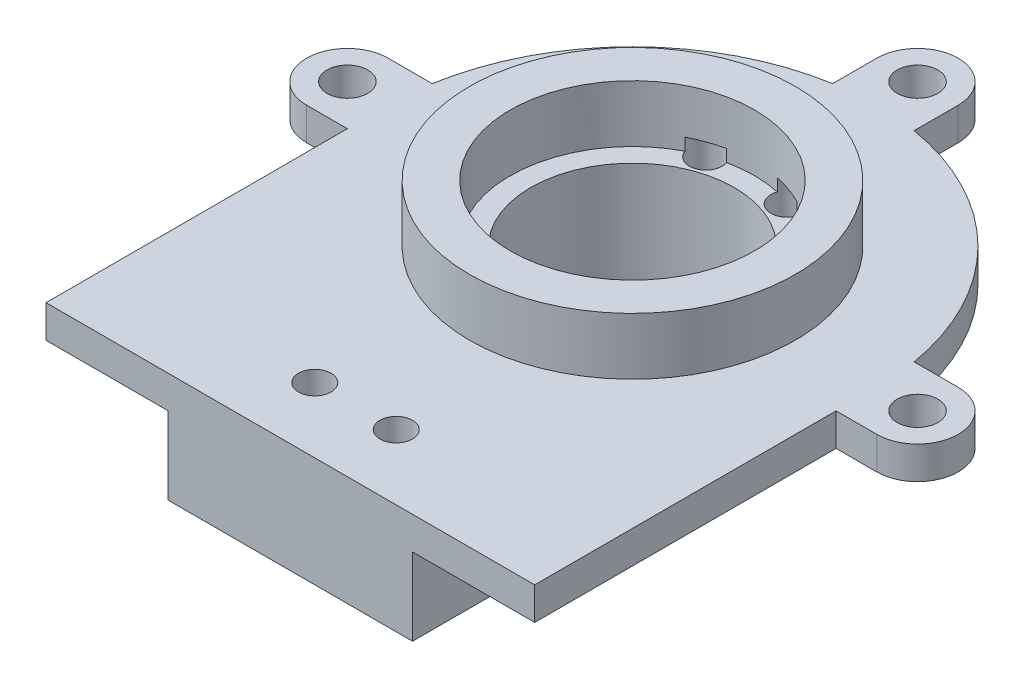
ISO-10303-21;
HEADER;
FILE_DESCRIPTION(('STEP AP214'),'2;1');
FILE_NAME('part.step','',(''),(''),'','','');
FILE_SCHEMA(('AUTOMOTIVE_DESIGN { 1 0 10303 214 1 1 1 1 }'));
ENDSEC;
DATA;
#1=APPLICATION_CONTEXT('core data for automotive mechanical design processes');
#2=APPLICATION_PROTOCOL_DEFINITION('international standard','automotive_design',2000,#1);
#3=PRODUCT_CONTEXT('',#1,'mechanical');
#4=PRODUCT('Part','Part','',(#3));
#5=PRODUCT_RELATED_PRODUCT_CATEGORY('part','',(#4));
#6=PRODUCT_DEFINITION_FORMATION('','',#4);
#7=PRODUCT_DEFINITION_CONTEXT('part definition',#1,'design');
#8=PRODUCT_DEFINITION('design','',#6,#7);
#9=PRODUCT_DEFINITION_SHAPE('','',#8);
#10=(LENGTH_UNIT() NAMED_UNIT(*) SI_UNIT(.MILLI.,.METRE.));
#11=(NAMED_UNIT(*) PLANE_ANGLE_UNIT() SI_UNIT($,.RADIAN.));
#12=(NAMED_UNIT(*) SI_UNIT($,.STERADIAN.) SOLID_ANGLE_UNIT());
#13=UNCERTAINTY_MEASURE_WITH_UNIT(LENGTH_MEASURE(1.E-05),#10,'distance_accuracy_value','');
#14=(GEOMETRIC_REPRESENTATION_CONTEXT(3) GLOBAL_UNCERTAINTY_ASSIGNED_CONTEXT((#13)) GLOBAL_UNIT_ASSIGNED_CONTEXT((#10,
#11,#12)) REPRESENTATION_CONTEXT('',''));
#15=CARTESIAN_POINT('',(0.,0.,0.));
#16=DIRECTION('',(0.,0.,1.));
#17=DIRECTION('',(1.,0.,0.));
#18=AXIS2_PLACEMENT_3D('',#15,#16,#17);
#19=CARTESIAN_POINT('',(0.,-9.5,0.));
#20=DIRECTION('',(0.,1.,0.));
#21=DIRECTION('',(0.,0.,1.));
#22=AXIS2_PLACEMENT_3D('',#19,#20,#21);
#23=CYLINDRICAL_SURFACE('',#22,30.);
#24=DIRECTION('',(0.,1.,0.));
#25=VECTOR('',#24,1.);
#26=CARTESIAN_POINT('',(29.5803989154981,-9.5,-5.));
#27=LINE('',#26,#25);
#28=CARTESIAN_POINT('',(29.5803989154981,-4.,-5.));
#29=VERTEX_POINT('',#28);
#30=CARTESIAN_POINT('',(29.5803989154981,0.,-5.));
#31=VERTEX_POINT('',#30);
#32=EDGE_CURVE('E223',#29,#31,#27,.T.);
#33=ORIENTED_EDGE('',*,*,#32,.F.);
#34=CARTESIAN_POINT('',(0.,-4.,0.));
#35=DIRECTION('',(0.,-1.,0.));
#36=DIRECTION('',(0.,0.,-1.));
#37=AXIS2_PLACEMENT_3D('',#34,#35,#36);
#38=CIRCLE('',#37,30.);
#39=CARTESIAN_POINT('',(5.,-4.,-29.5803989154981));
#40=VERTEX_POINT('',#39);
#41=EDGE_CURVE('E206',#40,#29,#38,.T.);
#42=ORIENTED_EDGE('',*,*,#41,.F.);
#43=DIRECTION('',(0.,1.,0.));
#44=VECTOR('',#43,1.);
#45=CARTESIAN_POINT('',(5.,-9.5,-29.5803989154981));
#46=LINE('',#45,#44);
#47=CARTESIAN_POINT('',(5.,0.,-29.5803989154981));
#48=VERTEX_POINT('',#47);
#49=EDGE_CURVE('E43',#48,#40,#46,.F.);
#50=ORIENTED_EDGE('',*,*,#49,.F.);
#51=CARTESIAN_POINT('',(0.,0.,0.));
#52=DIRECTION('',(0.,1.,0.));
#53=DIRECTION('',(0.,0.,1.));
#54=AXIS2_PLACEMENT_3D('',#51,#52,#53);
#55=CIRCLE('',#54,30.);
#56=EDGE_CURVE('E299',#31,#48,#55,.T.);
#57=ORIENTED_EDGE('',*,*,#56,.F.);
#58=EDGE_LOOP('',(#33,#42,#50,#57));
#59=FACE_BOUND('',#58,.T.);
#60=ADVANCED_FACE('F35',(#59),#23,.T.);
#61=CARTESIAN_POINT('',(0.,-4.,0.));
#62=DIRECTION('',(0.,-1.,0.));
#63=DIRECTION('',(0.,0.,-1.));
#64=AXIS2_PLACEMENT_3D('',#61,#62,#63);
#65=PLANE('',#64);
#66=DIRECTION('',(1.,0.,0.));
#67=VECTOR('',#66,1.);
#68=CARTESIAN_POINT('',(27.,-4.,5.));
#69=LINE('',#68,#67);
#70=CARTESIAN_POINT('',(30.,-4.,5.));
#71=VERTEX_POINT('',#70);
#72=CARTESIAN_POINT('',(35.,-4.,5.));
#73=VERTEX_POINT('',#72);
#74=EDGE_CURVE('E195',#71,#73,#69,.T.);
#75=ORIENTED_EDGE('',*,*,#74,.F.);
#76=DIRECTION('',(0.,0.,1.));
#77=VECTOR('',#76,1.);
#78=CARTESIAN_POINT('',(30.,-4.,0.));
#79=LINE('',#78,#77);
#80=CARTESIAN_POINT('',(30.,-4.,42.));
#81=VERTEX_POINT('',#80);
#82=EDGE_CURVE('E321',#71,#81,#79,.T.);
#83=ORIENTED_EDGE('',*,*,#82,.T.);
#84=DIRECTION('',(-1.,0.,0.));
#85=VECTOR('',#84,1.);
#86=CARTESIAN_POINT('',(0.,-4.,42.));
#87=LINE('',#86,#85);
#88=CARTESIAN_POINT('',(15.0000000000001,-4.,42.));
#89=VERTEX_POINT('',#88);
#90=EDGE_CURVE('E317',#81,#89,#87,.T.);
#91=ORIENTED_EDGE('',*,*,#90,.T.);
#92=DIRECTION('',(0.,0.,1.));
#93=VECTOR('',#92,1.);
#94=CARTESIAN_POINT('',(15.0000000000001,-4.,-21.9999999999996));
#95=LINE('',#94,#93);
#96=CARTESIAN_POINT('',(15.0000000000001,-4.,-21.9999999999996));
#97=VERTEX_POINT('',#96);
#98=EDGE_CURVE('E341',#97,#89,#95,.T.);
#99=ORIENTED_EDGE('',*,*,#98,.F.);
#100=DIRECTION('',(1.,0.,0.));
#101=VECTOR('',#100,1.);
#102=CARTESIAN_POINT('',(15.0000000000001,-4.,-21.9999999999996));
#103=LINE('',#102,#101);
#104=CARTESIAN_POINT('',(-14.9999999999998,-4.,-21.9999999999996));
#105=VERTEX_POINT('',#104);
#106=EDGE_CURVE('E346',#105,#97,#103,.T.);
#107=ORIENTED_EDGE('',*,*,#106,.F.);
#108=DIRECTION('',(0.,0.,-1.));
#109=VECTOR('',#108,1.);
#110=CARTESIAN_POINT('',(-14.9999999999998,-4.,-21.9999999999996));
#111=LINE('',#110,#109);
#112=CARTESIAN_POINT('',(-14.9999999999998,-4.,42.));
#113=VERTEX_POINT('',#112);
#114=EDGE_CURVE('E355',#113,#105,#111,.T.);
#115=ORIENTED_EDGE('',*,*,#114,.F.);
#116=CARTESIAN_POINT('',(-30.,-4.,42.));
#117=VERTEX_POINT('',#116);
#118=EDGE_CURVE('E312',#113,#117,#87,.T.);
#119=ORIENTED_EDGE('',*,*,#118,.T.);
#120=DIRECTION('',(0.,0.,-1.));
#121=VECTOR('',#120,1.);
#122=CARTESIAN_POINT('',(-30.,-4.,0.));
#123=LINE('',#122,#121);
#124=CARTESIAN_POINT('',(-30.,-4.,5.));
#125=VERTEX_POINT('',#124);
#126=EDGE_CURVE('E318',#117,#125,#123,.T.);
#127=ORIENTED_EDGE('',*,*,#126,.T.);
#128=DIRECTION('',(1.,0.,0.));
#129=VECTOR('',#128,1.);
#130=CARTESIAN_POINT('',(-27.,-4.,5.));
#131=LINE('',#130,#129);
#132=CARTESIAN_POINT('',(-35.,-4.,5.));
#133=VERTEX_POINT('',#132);
#134=EDGE_CURVE('E259',#133,#125,#131,.T.);
#135=ORIENTED_EDGE('',*,*,#134,.F.);
#136=CARTESIAN_POINT('',(-35.,-4.,0.));
#137=DIRECTION('',(0.,1.,0.));
#138=DIRECTION('',(0.,0.,1.));
#139=AXIS2_PLACEMENT_3D('',#136,#137,#138);
#140=CIRCLE('',#139,5.);
#141=CARTESIAN_POINT('',(-35.,-4.,-5.));
#142=VERTEX_POINT('',#141);
#143=EDGE_CURVE('E256',#142,#133,#140,.T.);
#144=ORIENTED_EDGE('',*,*,#143,.F.);
#145=DIRECTION('',(-1.,0.,0.));
#146=VECTOR('',#145,1.);
#147=CARTESIAN_POINT('',(-35.,-4.,-5.));
#148=LINE('',#147,#146);
#149=CARTESIAN_POINT('',(-29.5803989154981,-4.,-5.));
#150=VERTEX_POINT('',#149);
#151=EDGE_CURVE('E262',#150,#142,#148,.T.);
#152=ORIENTED_EDGE('',*,*,#151,.F.);
#153=CARTESIAN_POINT('',(-5.,-4.,-29.5803989154981));
#154=VERTEX_POINT('',#153);
#155=EDGE_CURVE('E323',#150,#154,#38,.T.);
#156=ORIENTED_EDGE('',*,*,#155,.T.);
#157=DIRECTION('',(0.,0.,1.));
#158=VECTOR('',#157,1.);
#159=CARTESIAN_POINT('',(-5.,-4.,-35.));
#160=LINE('',#159,#158);
#161=CARTESIAN_POINT('',(-5.,-4.,-35.));
#162=VERTEX_POINT('',#161);
#163=EDGE_CURVE('E236',#162,#154,#160,.T.);
#164=ORIENTED_EDGE('',*,*,#163,.F.);
#165=CARTESIAN_POINT('',(0.,-4.,-35.));
#166=DIRECTION('',(0.,1.,0.));
#167=DIRECTION('',(0.,0.,1.));
#168=AXIS2_PLACEMENT_3D('',#165,#166,#167);
#169=CIRCLE('',#168,5.);
#170=CARTESIAN_POINT('',(5.,-4.,-35.));
#171=VERTEX_POINT('',#170);
#172=EDGE_CURVE('E233',#171,#162,#169,.T.);
#173=ORIENTED_EDGE('',*,*,#172,.F.);
#174=DIRECTION('',(0.,0.,-1.));
#175=VECTOR('',#174,1.);
#176=CARTESIAN_POINT('',(5.,-4.,-27.));
#177=LINE('',#176,#175);
#178=EDGE_CURVE('E239',#40,#171,#177,.T.);
#179=ORIENTED_EDGE('',*,*,#178,.F.);
#180=ORIENTED_EDGE('',*,*,#41,.T.);
#181=DIRECTION('',(-1.,0.,0.));
#182=VECTOR('',#181,1.);
#183=CARTESIAN_POINT('',(35.,-4.,-5.));
#184=LINE('',#183,#182);
#185=CARTESIAN_POINT('',(35.,-4.,-5.));
#186=VERTEX_POINT('',#185);
#187=EDGE_CURVE('E186',#186,#29,#184,.T.);
#188=ORIENTED_EDGE('',*,*,#187,.F.);
#189=CARTESIAN_POINT('',(35.,-4.,0.));
#190=DIRECTION('',(0.,1.,0.));
#191=DIRECTION('',(0.,0.,1.));
#192=AXIS2_PLACEMENT_3D('',#189,#190,#191);
#193=CIRCLE('',#192,5.);
#194=EDGE_CURVE('E203',#73,#186,#193,.T.);
#195=ORIENTED_EDGE('',*,*,#194,.F.);
#196=EDGE_LOOP('',(#75,#83,#91,#99,#107,#115,#119,#127,#135,#144,#152,#156,#164,#173,#179,#180,
#188,#195));
#197=FACE_BOUND('',#196,.T.);
#198=CARTESIAN_POINT('',(-35.,-4.,0.));
#199=DIRECTION('',(0.,1.,0.));
#200=DIRECTION('',(0.,0.,1.));
#201=AXIS2_PLACEMENT_3D('',#198,#199,#200);
#202=CIRCLE('',#201,2.5);
#203=CARTESIAN_POINT('',(-35.,-4.,2.5));
#204=VERTEX_POINT('',#203);
#205=EDGE_CURVE('E250',#204,#204,#202,.T.);
#206=ORIENTED_EDGE('',*,*,#205,.T.);
#207=EDGE_LOOP('',(#206));
#208=FACE_BOUND('',#207,.T.);
#209=CARTESIAN_POINT('',(0.,-4.,-35.));
#210=DIRECTION('',(0.,1.,0.));
#211=DIRECTION('',(0.,0.,1.));
#212=AXIS2_PLACEMENT_3D('',#209,#210,#211);
#213=CIRCLE('',#212,2.5);
#214=CARTESIAN_POINT('',(0.,-4.,-32.5));
#215=VERTEX_POINT('',#214);
#216=EDGE_CURVE('E227',#215,#215,#213,.T.);
#217=ORIENTED_EDGE('',*,*,#216,.T.);
#218=EDGE_LOOP('',(#217));
#219=FACE_BOUND('',#218,.T.);
#220=CARTESIAN_POINT('',(35.,-4.,0.));
#221=DIRECTION('',(0.,1.,0.));
#222=DIRECTION('',(0.,0.,1.));
#223=AXIS2_PLACEMENT_3D('',#220,#221,#222);
#224=CIRCLE('',#223,2.5);
#225=CARTESIAN_POINT('',(35.,-4.,2.5));
#226=VERTEX_POINT('',#225);
#227=EDGE_CURVE('E221',#226,#226,#224,.T.);
#228=ORIENTED_EDGE('',*,*,#227,.T.);
#229=EDGE_LOOP('',(#228));
#230=FACE_BOUND('',#229,.T.);
#231=ADVANCED_FACE('F201',(#197,#208,#219,#230),#65,.T.);
#232=CARTESIAN_POINT('',(0.,0.,0.));
#233=DIRECTION('',(0.,-1.,0.));
#234=DIRECTION('',(0.,0.,-1.));
#235=AXIS2_PLACEMENT_3D('',#232,#233,#234);
#236=PLANE('',#235);
#237=DIRECTION('',(-1.,0.,0.));
#238=VECTOR('',#237,1.);
#239=CARTESIAN_POINT('',(35.,0.,-5.));
#240=LINE('',#239,#238);
#241=CARTESIAN_POINT('',(35.,0.,-5.));
#242=VERTEX_POINT('',#241);
#243=EDGE_CURVE('E189',#242,#31,#240,.T.);
#244=ORIENTED_EDGE('',*,*,#243,.T.);
#245=ORIENTED_EDGE('',*,*,#56,.T.);
#246=DIRECTION('',(0.,0.,-1.));
#247=VECTOR('',#246,1.);
#248=CARTESIAN_POINT('',(5.,0.,-27.));
#249=LINE('',#248,#247);
#250=CARTESIAN_POINT('',(5.,0.,-35.));
#251=VERTEX_POINT('',#250);
#252=EDGE_CURVE('E237',#48,#251,#249,.T.);
#253=ORIENTED_EDGE('',*,*,#252,.T.);
#254=CARTESIAN_POINT('',(0.,0.,-35.));
#255=DIRECTION('',(0.,1.,0.));
#256=DIRECTION('',(0.,0.,1.));
#257=AXIS2_PLACEMENT_3D('',#254,#255,#256);
#258=CIRCLE('',#257,5.);
#259=CARTESIAN_POINT('',(-5.,0.,-35.));
#260=VERTEX_POINT('',#259);
#261=EDGE_CURVE('E230',#251,#260,#258,.T.);
#262=ORIENTED_EDGE('',*,*,#261,.T.);
#263=DIRECTION('',(0.,0.,1.));
#264=VECTOR('',#263,1.);
#265=CARTESIAN_POINT('',(-5.,0.,-35.));
#266=LINE('',#265,#264);
#267=CARTESIAN_POINT('',(-5.,0.,-29.5803989154981));
#268=VERTEX_POINT('',#267);
#269=EDGE_CURVE('E50',#260,#268,#266,.T.);
#270=ORIENTED_EDGE('',*,*,#269,.T.);
#271=CARTESIAN_POINT('',(-29.5803989154981,0.,-5.));
#272=VERTEX_POINT('',#271);
#273=EDGE_CURVE('E298',#268,#272,#55,.T.);
#274=ORIENTED_EDGE('',*,*,#273,.T.);
#275=DIRECTION('',(-1.,0.,0.));
#276=VECTOR('',#275,1.);
#277=CARTESIAN_POINT('',(-35.,0.,-5.));
#278=LINE('',#277,#276);
#279=CARTESIAN_POINT('',(-35.,0.,-5.));
#280=VERTEX_POINT('',#279);
#281=EDGE_CURVE('E260',#272,#280,#278,.T.);
#282=ORIENTED_EDGE('',*,*,#281,.T.);
#283=CARTESIAN_POINT('',(-35.,0.,0.));
#284=DIRECTION('',(0.,1.,0.));
#285=DIRECTION('',(0.,0.,1.));
#286=AXIS2_PLACEMENT_3D('',#283,#284,#285);
#287=CIRCLE('',#286,5.);
#288=CARTESIAN_POINT('',(-35.,0.,5.));
#289=VERTEX_POINT('',#288);
#290=EDGE_CURVE('E253',#280,#289,#287,.T.);
#291=ORIENTED_EDGE('',*,*,#290,.T.);
#292=DIRECTION('',(1.,0.,0.));
#293=VECTOR('',#292,1.);
#294=CARTESIAN_POINT('',(-27.,0.,5.));
#295=LINE('',#294,#293);
#296=CARTESIAN_POINT('',(-30.,0.,5.));
#297=VERTEX_POINT('',#296);
#298=EDGE_CURVE('E57',#289,#297,#295,.T.);
#299=ORIENTED_EDGE('',*,*,#298,.T.);
#300=DIRECTION('',(0.,0.,1.));
#301=VECTOR('',#300,1.);
#302=CARTESIAN_POINT('',(-30.,0.,0.));
#303=LINE('',#302,#301);
#304=CARTESIAN_POINT('',(-30.,0.,42.));
#305=VERTEX_POINT('',#304);
#306=EDGE_CURVE('E301',#297,#305,#303,.T.);
#307=ORIENTED_EDGE('',*,*,#306,.T.);
#308=DIRECTION('',(1.,0.,0.));
#309=VECTOR('',#308,1.);
#310=CARTESIAN_POINT('',(-30.,0.,42.));
#311=LINE('',#310,#309);
#312=CARTESIAN_POINT('',(30.,0.,42.));
#313=VERTEX_POINT('',#312);
#314=EDGE_CURVE('E303',#305,#313,#311,.T.);
#315=ORIENTED_EDGE('',*,*,#314,.T.);
#316=DIRECTION('',(0.,0.,-1.));
#317=VECTOR('',#316,1.);
#318=CARTESIAN_POINT('',(30.,0.,42.));
#319=LINE('',#318,#317);
#320=CARTESIAN_POINT('',(30.,0.,5.));
#321=VERTEX_POINT('',#320);
#322=EDGE_CURVE('E306',#313,#321,#319,.T.);
#323=ORIENTED_EDGE('',*,*,#322,.T.);
#324=DIRECTION('',(1.,0.,0.));
#325=VECTOR('',#324,1.);
#326=CARTESIAN_POINT('',(27.,0.,5.));
#327=LINE('',#326,#325);
#328=CARTESIAN_POINT('',(35.,0.,5.));
#329=VERTEX_POINT('',#328);
#330=EDGE_CURVE('E211',#321,#329,#327,.T.);
#331=ORIENTED_EDGE('',*,*,#330,.T.);
#332=CARTESIAN_POINT('',(35.,0.,0.));
#333=DIRECTION('',(0.,1.,0.));
#334=DIRECTION('',(0.,0.,1.));
#335=AXIS2_PLACEMENT_3D('',#332,#333,#334);
#336=CIRCLE('',#335,5.);
#337=EDGE_CURVE('E219',#329,#242,#336,.T.);
#338=ORIENTED_EDGE('',*,*,#337,.T.);
#339=EDGE_LOOP('',(#244,#245,#253,#262,#270,#274,#282,#291,#299,#307,#315,#323,#331,#338));
#340=FACE_BOUND('',#339,.T.);
#341=CARTESIAN_POINT('',(5.00000000000064,0.,34.0000000000004));
#342=DIRECTION('',(0.,-1.,0.));
#343=DIRECTION('',(0.,0.,-1.));
#344=AXIS2_PLACEMENT_3D('',#341,#342,#343);
#345=CIRCLE('',#344,2.00000000010648);
#346=CARTESIAN_POINT('',(5.00000000000064,0.,31.9999999998939));
#347=VERTEX_POINT('',#346);
#348=EDGE_CURVE('E281',#347,#347,#345,.T.);
#349=ORIENTED_EDGE('',*,*,#348,.T.);
#350=EDGE_LOOP('',(#349));
#351=FACE_BOUND('',#350,.T.);
#352=CARTESIAN_POINT('',(-4.99999999999936,0.,34.0000000000004));
#353=DIRECTION('',(0.,-1.,0.));
#354=DIRECTION('',(0.,0.,-1.));
#355=AXIS2_PLACEMENT_3D('',#352,#353,#354);
#356=CIRCLE('',#355,2.00000000010648);
#357=CARTESIAN_POINT('',(-4.99999999999936,0.,31.9999999998939));
#358=VERTEX_POINT('',#357);
#359=EDGE_CURVE('E278',#358,#358,#356,.T.);
#360=ORIENTED_EDGE('',*,*,#359,.T.);
#361=EDGE_LOOP('',(#360));
#362=FACE_BOUND('',#361,.T.);
#363=CARTESIAN_POINT('',(0.,0.,0.));
#364=DIRECTION('',(0.,1.,0.));
#365=DIRECTION('',(0.,0.,1.));
#366=AXIS2_PLACEMENT_3D('',#363,#364,#365);
#367=CIRCLE('',#366,20.);
#368=CARTESIAN_POINT('',(0.,0.,20.));
#369=VERTEX_POINT('',#368);
#370=EDGE_CURVE('E370',#369,#369,#367,.T.);
#371=ORIENTED_EDGE('',*,*,#370,.F.);
#372=EDGE_LOOP('',(#371));
#373=FACE_BOUND('',#372,.T.);
#374=CARTESIAN_POINT('',(-35.,0.,0.));
#375=DIRECTION('',(0.,1.,0.));
#376=DIRECTION('',(0.,0.,1.));
#377=AXIS2_PLACEMENT_3D('',#374,#375,#376);
#378=CIRCLE('',#377,2.5);
#379=CARTESIAN_POINT('',(-35.,0.,2.5));
#380=VERTEX_POINT('',#379);
#381=EDGE_CURVE('E248',#380,#380,#378,.T.);
#382=ORIENTED_EDGE('',*,*,#381,.F.);
#383=EDGE_LOOP('',(#382));
#384=FACE_BOUND('',#383,.T.);
#385=CARTESIAN_POINT('',(0.,0.,-35.));
#386=DIRECTION('',(0.,1.,0.));
#387=DIRECTION('',(0.,0.,1.));
#388=AXIS2_PLACEMENT_3D('',#385,#386,#387);
#389=CIRCLE('',#388,2.5);
#390=CARTESIAN_POINT('',(0.,0.,-32.5));
#391=VERTEX_POINT('',#390);
#392=EDGE_CURVE('E226',#391,#391,#389,.T.);
#393=ORIENTED_EDGE('',*,*,#392,.F.);
#394=EDGE_LOOP('',(#393));
#395=FACE_BOUND('',#394,.T.);
#396=CARTESIAN_POINT('',(35.,0.,0.));
#397=DIRECTION('',(0.,1.,0.));
#398=DIRECTION('',(0.,0.,1.));
#399=AXIS2_PLACEMENT_3D('',#396,#397,#398);
#400=CIRCLE('',#399,2.5);
#401=CARTESIAN_POINT('',(35.,0.,2.5));
#402=VERTEX_POINT('',#401);
#403=EDGE_CURVE('E215',#402,#402,#400,.T.);
#404=ORIENTED_EDGE('',*,*,#403,.F.);
#405=EDGE_LOOP('',(#404));
#406=FACE_BOUND('',#405,.T.);
#407=ADVANCED_FACE('F403',(#340,#351,#362,#373,#384,#395,#406),#236,.F.);
#408=CARTESIAN_POINT('',(0.,7.,0.));
#409=DIRECTION('',(0.,1.,0.));
#410=DIRECTION('',(0.,0.,1.));
#411=AXIS2_PLACEMENT_3D('',#408,#409,#410);
#412=PLANE('',#411);
#413=CARTESIAN_POINT('',(0.,7.,0.));
#414=DIRECTION('',(0.,1.,0.));
#415=DIRECTION('',(0.,0.,1.));
#416=AXIS2_PLACEMENT_3D('',#413,#414,#415);
#417=CIRCLE('',#416,20.);
#418=CARTESIAN_POINT('',(0.,7.,20.));
#419=VERTEX_POINT('',#418);
#420=EDGE_CURVE('E374',#419,#419,#417,.T.);
#421=ORIENTED_EDGE('',*,*,#420,.T.);
#422=EDGE_LOOP('',(#421));
#423=FACE_BOUND('',#422,.T.);
#424=CARTESIAN_POINT('',(0.,7.,0.));
#425=DIRECTION('',(0.,1.,0.));
#426=DIRECTION('',(0.,0.,1.));
#427=AXIS2_PLACEMENT_3D('',#424,#425,#426);
#428=CIRCLE('',#427,15.);
#429=CARTESIAN_POINT('',(0.,7.,15.));
#430=VERTEX_POINT('',#429);
#431=EDGE_CURVE('E371',#430,#430,#428,.T.);
#432=ORIENTED_EDGE('',*,*,#431,.F.);
#433=EDGE_LOOP('',(#432));
#434=FACE_BOUND('',#433,.T.);
#435=ADVANCED_FACE('F525',(#423,#434),#412,.T.);
#436=CARTESIAN_POINT('',(0.,7.,0.));
#437=DIRECTION('',(0.,-1.,0.));
#438=DIRECTION('',(0.,0.,-1.));
#439=AXIS2_PLACEMENT_3D('',#436,#437,#438);
#440=CYLINDRICAL_SURFACE('',#439,20.);
#441=ORIENTED_EDGE('',*,*,#420,.F.);
#442=EDGE_LOOP('',(#441));
#443=FACE_BOUND('',#442,.T.);
#444=ORIENTED_EDGE('',*,*,#370,.T.);
#445=EDGE_LOOP('',(#444));
#446=FACE_BOUND('',#445,.T.);
#447=ADVANCED_FACE('F37',(#443,#446),#440,.T.);
#448=CARTESIAN_POINT('',(0.,7.,0.));
#449=DIRECTION('',(0.,-1.,0.));
#450=DIRECTION('',(0.,0.,-1.));
#451=AXIS2_PLACEMENT_3D('',#448,#449,#450);
#452=CYLINDRICAL_SURFACE('',#451,15.);
#453=DIRECTION('',(0.,-1.,0.));
#454=VECTOR('',#453,1.);
#455=CARTESIAN_POINT('',(-3.11651617670493,-6.,-14.6726727940187));
#456=LINE('',#455,#454);
#457=CARTESIAN_POINT('',(-3.11651617670494,0.,-14.6726727940187));
#458=VERTEX_POINT('',#457);
#459=CARTESIAN_POINT('',(-3.11651617670493,1.5,-14.6726727940187));
#460=VERTEX_POINT('',#459);
#461=EDGE_CURVE('E289',#458,#460,#456,.F.);
#462=ORIENTED_EDGE('',*,*,#461,.F.);
#463=CARTESIAN_POINT('',(0.,0.,0.));
#464=DIRECTION('',(0.,1.,0.));
#465=DIRECTION('',(0.,0.,1.));
#466=AXIS2_PLACEMENT_3D('',#463,#464,#465);
#467=CIRCLE('',#466,15.);
#468=CARTESIAN_POINT('',(3.11651617670606,0.,-14.6726727940185));
#469=VERTEX_POINT('',#468);
#470=EDGE_CURVE('E375',#469,#458,#467,.T.);
#471=ORIENTED_EDGE('',*,*,#470,.F.);
#472=DIRECTION('',(0.,-1.,0.));
#473=VECTOR('',#472,1.);
#474=CARTESIAN_POINT('',(3.11651617670607,-6.,-14.6726727940185));
#475=LINE('',#474,#473);
#476=CARTESIAN_POINT('',(3.11651617670607,1.5,-14.6726727940185));
#477=VERTEX_POINT('',#476);
#478=EDGE_CURVE('E294',#477,#469,#475,.T.);
#479=ORIENTED_EDGE('',*,*,#478,.F.);
#480=CARTESIAN_POINT('',(0.,1.5,0.));
#481=DIRECTION('',(0.,-1.,0.));
#482=DIRECTION('',(0.,0.,-1.));
#483=AXIS2_PLACEMENT_3D('',#480,#481,#482);
#484=CIRCLE('',#483,15.);
#485=CARTESIAN_POINT('',(6.8834838232857,1.5,-13.3273272059541));
#486=VERTEX_POINT('',#485);
#487=EDGE_CURVE('E381',#477,#486,#484,.T.);
#488=ORIENTED_EDGE('',*,*,#487,.T.);
#489=DIRECTION('',(0.,-1.,0.));
#490=VECTOR('',#489,1.);
#491=CARTESIAN_POINT('',(6.8834838232857,-6.,-13.3273272059541));
#492=LINE('',#491,#490);
#493=CARTESIAN_POINT('',(6.8834838232857,0.,-13.3273272059541));
#494=VERTEX_POINT('',#493);
#495=EDGE_CURVE('E296',#494,#486,#492,.F.);
#496=ORIENTED_EDGE('',*,*,#495,.F.);
#497=CARTESIAN_POINT('',(-6.88348382328487,0.,-13.3273272059545));
#498=VERTEX_POINT('',#497);
#499=EDGE_CURVE('E376',#498,#494,#467,.T.);
#500=ORIENTED_EDGE('',*,*,#499,.F.);
#501=DIRECTION('',(0.,-1.,0.));
#502=VECTOR('',#501,1.);
#503=CARTESIAN_POINT('',(-6.88348382328487,-6.,-13.3273272059545));
#504=LINE('',#503,#502);
#505=CARTESIAN_POINT('',(-6.88348382328487,1.5,-13.3273272059545));
#506=VERTEX_POINT('',#505);
#507=EDGE_CURVE('E287',#506,#498,#504,.T.);
#508=ORIENTED_EDGE('',*,*,#507,.F.);
#509=CARTESIAN_POINT('',(0.,1.5,0.));
#510=DIRECTION('',(0.,-1.,0.));
#511=DIRECTION('',(0.,0.,-1.));
#512=AXIS2_PLACEMENT_3D('',#509,#510,#511);
#513=CIRCLE('',#512,15.);
#514=EDGE_CURVE('E386',#506,#460,#513,.T.);
#515=ORIENTED_EDGE('',*,*,#514,.T.);
#516=EDGE_LOOP('',(#462,#471,#479,#488,#496,#500,#508,#515));
#517=FACE_BOUND('',#516,.T.);
#518=ORIENTED_EDGE('',*,*,#431,.T.);
#519=EDGE_LOOP('',(#518));
#520=FACE_BOUND('',#519,.T.);
#521=ADVANCED_FACE('F526',(#517,#520),#452,.F.);
#522=CARTESIAN_POINT('',(0.,0.,0.));
#523=DIRECTION('',(0.,-1.,0.));
#524=DIRECTION('',(0.,0.,-1.));
#525=AXIS2_PLACEMENT_3D('',#522,#523,#524);
#526=CIRCLE('',#525,12.5);
#527=CARTESIAN_POINT('',(0.,0.,-12.5));
#528=VERTEX_POINT('',#527);
#529=EDGE_CURVE('E367',#528,#528,#526,.T.);
#530=ORIENTED_EDGE('',*,*,#529,.T.);
#531=EDGE_LOOP('',(#530));
#532=FACE_BOUND('',#531,.T.);
#533=ORIENTED_EDGE('',*,*,#470,.T.);
#534=CARTESIAN_POINT('',(-4.99999999999953,0.,-13.9999999999996));
#535=DIRECTION('',(0.,-1.,0.));
#536=DIRECTION('',(0.,0.,-1.));
#537=AXIS2_PLACEMENT_3D('',#534,#535,#536);
#538=CIRCLE('',#537,2.00000000010648);
#539=EDGE_CURVE('E284',#458,#498,#538,.T.);
#540=ORIENTED_EDGE('',*,*,#539,.T.);
#541=ORIENTED_EDGE('',*,*,#499,.T.);
#542=CARTESIAN_POINT('',(5.00000000000064,0.,-13.9999999999996));
#543=DIRECTION('',(0.,-1.,0.));
#544=DIRECTION('',(0.,0.,-1.));
#545=AXIS2_PLACEMENT_3D('',#542,#543,#544);
#546=CIRCLE('',#545,2.00000000010637);
#547=EDGE_CURVE('E291',#494,#469,#546,.T.);
#548=ORIENTED_EDGE('',*,*,#547,.T.);
#549=EDGE_LOOP('',(#533,#540,#541,#548));
#550=FACE_BOUND('',#549,.T.);
#551=ADVANCED_FACE('F520',(#532,#550),#236,.F.);
#552=CARTESIAN_POINT('',(0.,-4.,0.));
#553=DIRECTION('',(0.,1.,0.));
#554=DIRECTION('',(0.,0.,1.));
#555=AXIS2_PLACEMENT_3D('',#552,#553,#554);
#556=CYLINDRICAL_SURFACE('',#555,12.5);
#557=ORIENTED_EDGE('',*,*,#529,.F.);
#558=EDGE_LOOP('',(#557));
#559=FACE_BOUND('',#558,.T.);
#560=CARTESIAN_POINT('',(0.,-13.5,0.));
#561=DIRECTION('',(0.,-1.,0.));
#562=DIRECTION('',(0.,0.,-1.));
#563=AXIS2_PLACEMENT_3D('',#560,#561,#562);
#564=CIRCLE('',#563,12.5);
#565=CARTESIAN_POINT('',(0.,-13.5,-12.5));
#566=VERTEX_POINT('',#565);
#567=EDGE_CURVE('E326',#566,#566,#564,.T.);
#568=ORIENTED_EDGE('',*,*,#567,.T.);
#569=EDGE_LOOP('',(#568));
#570=FACE_BOUND('',#569,.T.);
#571=ADVANCED_FACE('F509',(#559,#570),#556,.F.);
#572=CARTESIAN_POINT('',(0.,-13.5,0.));
#573=DIRECTION('',(0.,-1.,0.));
#574=DIRECTION('',(0.,0.,-1.));
#575=AXIS2_PLACEMENT_3D('',#572,#573,#574);
#576=PLANE('',#575);
#577=CARTESIAN_POINT('',(5.00000000000047,-13.5,-13.9999999999996));
#578=DIRECTION('',(0.,-1.,0.));
#579=DIRECTION('',(0.,0.,-1.));
#580=AXIS2_PLACEMENT_3D('',#577,#578,#579);
#581=CIRCLE('',#580,2.00000000010648);
#582=CARTESIAN_POINT('',(5.00000000000047,-13.5,-16.0000000001061));
#583=VERTEX_POINT('',#582);
#584=EDGE_CURVE('E329',#583,#583,#581,.T.);
#585=ORIENTED_EDGE('',*,*,#584,.F.);
#586=EDGE_LOOP('',(#585));
#587=FACE_BOUND('',#586,.T.);
#588=CARTESIAN_POINT('',(5.00000000000064,-13.5,34.0000000000004));
#589=DIRECTION('',(0.,-1.,0.));
#590=DIRECTION('',(0.,0.,-1.));
#591=AXIS2_PLACEMENT_3D('',#588,#589,#590);
#592=CIRCLE('',#591,2.00000000010648);
#593=CARTESIAN_POINT('',(5.00000000000064,-13.5,31.9999999998939));
#594=VERTEX_POINT('',#593);
#595=EDGE_CURVE('E335',#594,#594,#592,.T.);
#596=ORIENTED_EDGE('',*,*,#595,.F.);
#597=EDGE_LOOP('',(#596));
#598=FACE_BOUND('',#597,.T.);
#599=DIRECTION('',(0.,0.,1.));
#600=VECTOR('',#599,1.);
#601=CARTESIAN_POINT('',(15.0000000000001,-13.5,-21.9999999999996));
#602=LINE('',#601,#600);
#603=CARTESIAN_POINT('',(15.0000000000001,-13.5,-21.9999999999996));
#604=VERTEX_POINT('',#603);
#605=CARTESIAN_POINT('',(15.0000000000001,-13.5,42.0000000000004));
#606=VERTEX_POINT('',#605);
#607=EDGE_CURVE('E342',#604,#606,#602,.T.);
#608=ORIENTED_EDGE('',*,*,#607,.T.);
#609=DIRECTION('',(-1.,0.,0.));
#610=VECTOR('',#609,1.);
#611=CARTESIAN_POINT('',(15.0000000000001,-13.5,42.0000000000004));
#612=LINE('',#611,#610);
#613=CARTESIAN_POINT('',(-14.9999999999998,-13.5,42.0000000000004));
#614=VERTEX_POINT('',#613);
#615=EDGE_CURVE('E345',#606,#614,#612,.T.);
#616=ORIENTED_EDGE('',*,*,#615,.T.);
#617=DIRECTION('',(0.,0.,-1.));
#618=VECTOR('',#617,1.);
#619=CARTESIAN_POINT('',(-14.9999999999998,-13.5,-21.9999999999996));
#620=LINE('',#619,#618);
#621=CARTESIAN_POINT('',(-14.9999999999998,-13.5,-21.9999999999996));
#622=VERTEX_POINT('',#621);
#623=EDGE_CURVE('E348',#614,#622,#620,.T.);
#624=ORIENTED_EDGE('',*,*,#623,.T.);
#625=DIRECTION('',(1.,0.,0.));
#626=VECTOR('',#625,1.);
#627=CARTESIAN_POINT('',(15.0000000000001,-13.5,-21.9999999999996));
#628=LINE('',#627,#626);
#629=EDGE_CURVE('E350',#622,#604,#628,.T.);
#630=ORIENTED_EDGE('',*,*,#629,.T.);
#631=EDGE_LOOP('',(#608,#616,#624,#630));
#632=FACE_BOUND('',#631,.T.);
#633=CARTESIAN_POINT('',(-4.99999999999936,-13.5,34.0000000000004));
#634=DIRECTION('',(0.,-1.,0.));
#635=DIRECTION('',(0.,0.,-1.));
#636=AXIS2_PLACEMENT_3D('',#633,#634,#635);
#637=CIRCLE('',#636,2.00000000010648);
#638=CARTESIAN_POINT('',(-4.99999999999936,-13.5,31.9999999998939));
#639=VERTEX_POINT('',#638);
#640=EDGE_CURVE('E338',#639,#639,#637,.T.);
#641=ORIENTED_EDGE('',*,*,#640,.F.);
#642=EDGE_LOOP('',(#641));
#643=FACE_BOUND('',#642,.T.);
#644=CARTESIAN_POINT('',(-4.99999999999953,-13.5,-13.9999999999996));
#645=DIRECTION('',(0.,-1.,0.));
#646=DIRECTION('',(0.,0.,-1.));
#647=AXIS2_PLACEMENT_3D('',#644,#645,#646);
#648=CIRCLE('',#647,2.00000000010648);
#649=CARTESIAN_POINT('',(-4.99999999999953,-13.5,-16.0000000001061));
#650=VERTEX_POINT('',#649);
#651=EDGE_CURVE('E332',#650,#650,#648,.T.);
#652=ORIENTED_EDGE('',*,*,#651,.F.);
#653=EDGE_LOOP('',(#652));
#654=FACE_BOUND('',#653,.T.);
#655=ORIENTED_EDGE('',*,*,#567,.F.);
#656=EDGE_LOOP('',(#655));
#657=FACE_BOUND('',#656,.T.);
#658=ADVANCED_FACE('F506',(#587,#598,#632,#643,#654,#657),#576,.T.);
#659=CARTESIAN_POINT('',(15.0000000000001,-13.5,-21.9999999999996));
#660=DIRECTION('',(-1.,0.,0.));
#661=DIRECTION('',(0.,0.,1.));
#662=AXIS2_PLACEMENT_3D('',#659,#660,#661);
#663=PLANE('',#662);
#664=ORIENTED_EDGE('',*,*,#98,.T.);
#665=DIRECTION('',(0.,1.,0.));
#666=VECTOR('',#665,1.);
#667=CARTESIAN_POINT('',(15.0000000000001,-13.5,42.0000000000004));
#668=LINE('',#667,#666);
#669=EDGE_CURVE('E365',#606,#89,#668,.T.);
#670=ORIENTED_EDGE('',*,*,#669,.F.);
#671=ORIENTED_EDGE('',*,*,#607,.F.);
#672=DIRECTION('',(0.,1.,0.));
#673=VECTOR('',#672,1.);
#674=CARTESIAN_POINT('',(15.0000000000001,-13.5,-21.9999999999996));
#675=LINE('',#674,#673);
#676=EDGE_CURVE('E352',#604,#97,#675,.T.);
#677=ORIENTED_EDGE('',*,*,#676,.T.);
#678=EDGE_LOOP('',(#664,#670,#671,#677));
#679=FACE_BOUND('',#678,.T.);
#680=ADVANCED_FACE('F424',(#679),#663,.F.);
#681=CARTESIAN_POINT('',(15.0000000000001,-13.5,42.0000000000004));
#682=DIRECTION('',(0.,0.,-1.));
#683=DIRECTION('',(-1.,0.,0.));
#684=AXIS2_PLACEMENT_3D('',#681,#682,#683);
#685=PLANE('',#684);
#686=ORIENTED_EDGE('',*,*,#118,.F.);
#687=DIRECTION('',(0.,1.,0.));
#688=VECTOR('',#687,1.);
#689=CARTESIAN_POINT('',(-14.9999999999998,-13.5,42.0000000000004));
#690=LINE('',#689,#688);
#691=EDGE_CURVE('E363',#614,#113,#690,.T.);
#692=ORIENTED_EDGE('',*,*,#691,.F.);
#693=ORIENTED_EDGE('',*,*,#615,.F.);
#694=ORIENTED_EDGE('',*,*,#669,.T.);
#695=ORIENTED_EDGE('',*,*,#90,.F.);
#696=DIRECTION('',(0.,1.,0.));
#697=VECTOR('',#696,1.);
#698=CARTESIAN_POINT('',(30.,-9.5,42.));
#699=LINE('',#698,#697);
#700=EDGE_CURVE('E310',#81,#313,#699,.T.);
#701=ORIENTED_EDGE('',*,*,#700,.T.);
#702=ORIENTED_EDGE('',*,*,#314,.F.);
#703=DIRECTION('',(0.,1.,0.));
#704=VECTOR('',#703,1.);
#705=CARTESIAN_POINT('',(-30.,-9.5,42.));
#706=LINE('',#705,#704);
#707=EDGE_CURVE('E309',#117,#305,#706,.T.);
#708=ORIENTED_EDGE('',*,*,#707,.F.);
#709=EDGE_LOOP('',(#686,#692,#693,#694,#695,#701,#702,#708));
#710=FACE_BOUND('',#709,.T.);
#711=ADVANCED_FACE('F418',(#710),#685,.F.);
#712=CARTESIAN_POINT('',(-14.9999999999998,-13.5,-21.9999999999996));
#713=DIRECTION('',(1.,0.,0.));
#714=DIRECTION('',(0.,0.,-1.));
#715=AXIS2_PLACEMENT_3D('',#712,#713,#714);
#716=PLANE('',#715);
#717=ORIENTED_EDGE('',*,*,#114,.T.);
#718=DIRECTION('',(0.,1.,0.));
#719=VECTOR('',#718,1.);
#720=CARTESIAN_POINT('',(-14.9999999999998,-13.5,-21.9999999999996));
#721=LINE('',#720,#719);
#722=EDGE_CURVE('E361',#622,#105,#721,.T.);
#723=ORIENTED_EDGE('',*,*,#722,.F.);
#724=ORIENTED_EDGE('',*,*,#623,.F.);
#725=ORIENTED_EDGE('',*,*,#691,.T.);
#726=EDGE_LOOP('',(#717,#723,#724,#725));
#727=FACE_BOUND('',#726,.T.);
#728=ADVANCED_FACE('F433',(#727),#716,.F.);
#729=CARTESIAN_POINT('',(15.0000000000001,-13.5,-21.9999999999996));
#730=DIRECTION('',(0.,0.,1.));
#731=DIRECTION('',(1.,0.,0.));
#732=AXIS2_PLACEMENT_3D('',#729,#730,#731);
#733=PLANE('',#732);
#734=ORIENTED_EDGE('',*,*,#106,.T.);
#735=ORIENTED_EDGE('',*,*,#676,.F.);
#736=ORIENTED_EDGE('',*,*,#629,.F.);
#737=ORIENTED_EDGE('',*,*,#722,.T.);
#738=EDGE_LOOP('',(#734,#735,#736,#737));
#739=FACE_BOUND('',#738,.T.);
#740=ADVANCED_FACE('F429',(#739),#733,.F.);
#741=CARTESIAN_POINT('',(-4.99999999999936,-13.5,34.0000000000004));
#742=DIRECTION('',(0.,1.,0.));
#743=DIRECTION('',(0.,0.,1.));
#744=AXIS2_PLACEMENT_3D('',#741,#742,#743);
#745=CYLINDRICAL_SURFACE('',#744,2.00000000010648);
#746=ORIENTED_EDGE('',*,*,#640,.T.);
#747=EDGE_LOOP('',(#746));
#748=FACE_BOUND('',#747,.T.);
#749=ORIENTED_EDGE('',*,*,#359,.F.);
#750=EDGE_LOOP('',(#749));
#751=FACE_BOUND('',#750,.T.);
#752=ADVANCED_FACE('F501',(#748,#751),#745,.F.);
#753=CARTESIAN_POINT('',(5.00000000000064,-13.5,34.0000000000004));
#754=DIRECTION('',(0.,1.,0.));
#755=DIRECTION('',(0.,0.,1.));
#756=AXIS2_PLACEMENT_3D('',#753,#754,#755);
#757=CYLINDRICAL_SURFACE('',#756,2.00000000010648);
#758=ORIENTED_EDGE('',*,*,#595,.T.);
#759=EDGE_LOOP('',(#758));
#760=FACE_BOUND('',#759,.T.);
#761=ORIENTED_EDGE('',*,*,#348,.F.);
#762=EDGE_LOOP('',(#761));
#763=FACE_BOUND('',#762,.T.);
#764=ADVANCED_FACE('F494',(#760,#763),#757,.F.);
#765=CARTESIAN_POINT('',(-4.99999999999953,-13.5,-13.9999999999996));
#766=DIRECTION('',(0.,1.,0.));
#767=DIRECTION('',(0.,0.,1.));
#768=AXIS2_PLACEMENT_3D('',#765,#766,#767);
#769=CYLINDRICAL_SURFACE('',#768,2.00000000010648);
#770=ORIENTED_EDGE('',*,*,#651,.T.);
#771=EDGE_LOOP('',(#770));
#772=FACE_BOUND('',#771,.T.);
#773=ORIENTED_EDGE('',*,*,#461,.T.);
#774=CARTESIAN_POINT('',(-4.99999999999953,1.5,-13.9999999999996));
#775=DIRECTION('',(0.,-1.,0.));
#776=DIRECTION('',(0.,0.,-1.));
#777=AXIS2_PLACEMENT_3D('',#774,#775,#776);
#778=CIRCLE('',#777,2.00000000010648);
#779=EDGE_CURVE('E275',#506,#460,#778,.T.);
#780=ORIENTED_EDGE('',*,*,#779,.F.);
#781=ORIENTED_EDGE('',*,*,#507,.T.);
#782=ORIENTED_EDGE('',*,*,#539,.F.);
#783=EDGE_LOOP('',(#773,#780,#781,#782));
#784=FACE_BOUND('',#783,.T.);
#785=ADVANCED_FACE('F489',(#772,#784),#769,.F.);
#786=CARTESIAN_POINT('',(5.00000000000047,-13.5,-13.9999999999996));
#787=DIRECTION('',(0.,1.,0.));
#788=DIRECTION('',(0.,0.,1.));
#789=AXIS2_PLACEMENT_3D('',#786,#787,#788);
#790=CYLINDRICAL_SURFACE('',#789,2.00000000010648);
#791=ORIENTED_EDGE('',*,*,#584,.T.);
#792=EDGE_LOOP('',(#791));
#793=FACE_BOUND('',#792,.T.);
#794=ORIENTED_EDGE('',*,*,#495,.T.);
#795=CARTESIAN_POINT('',(5.00000000000064,1.5,-13.9999999999996));
#796=DIRECTION('',(0.,-1.,0.));
#797=DIRECTION('',(0.,0.,-1.));
#798=AXIS2_PLACEMENT_3D('',#795,#796,#797);
#799=CIRCLE('',#798,2.00000000010637);
#800=EDGE_CURVE('E271',#477,#486,#799,.T.);
#801=ORIENTED_EDGE('',*,*,#800,.F.);
#802=ORIENTED_EDGE('',*,*,#478,.T.);
#803=ORIENTED_EDGE('',*,*,#547,.F.);
#804=EDGE_LOOP('',(#794,#801,#802,#803));
#805=FACE_BOUND('',#804,.T.);
#806=ADVANCED_FACE('F483',(#793,#805),#790,.F.);
#807=DIRECTION('',(0.,1.,0.));
#808=VECTOR('',#807,1.);
#809=CARTESIAN_POINT('',(-5.,-9.5,-29.5803989154981));
#810=LINE('',#809,#808);
#811=EDGE_CURVE('E393',#154,#268,#810,.T.);
#812=ORIENTED_EDGE('',*,*,#811,.F.);
#813=ORIENTED_EDGE('',*,*,#155,.F.);
#814=DIRECTION('',(0.,1.,0.));
#815=VECTOR('',#814,1.);
#816=CARTESIAN_POINT('',(-29.5803989154981,-9.5,-5.));
#817=LINE('',#816,#815);
#818=EDGE_CURVE('E391',#272,#150,#817,.F.);
#819=ORIENTED_EDGE('',*,*,#818,.F.);
#820=ORIENTED_EDGE('',*,*,#273,.F.);
#821=EDGE_LOOP('',(#812,#813,#819,#820));
#822=FACE_BOUND('',#821,.T.);
#823=ADVANCED_FACE('F455',(#822),#23,.T.);
#824=CARTESIAN_POINT('',(30.,-9.5,42.));
#825=DIRECTION('',(1.,0.,0.));
#826=DIRECTION('',(0.,0.,-1.));
#827=AXIS2_PLACEMENT_3D('',#824,#825,#826);
#828=PLANE('',#827);
#829=DIRECTION('',(0.,-1.,0.));
#830=VECTOR('',#829,1.);
#831=CARTESIAN_POINT('',(30.,-9.5,5.));
#832=LINE('',#831,#830);
#833=EDGE_CURVE('E11',#321,#71,#832,.T.);
#834=ORIENTED_EDGE('',*,*,#833,.F.);
#835=ORIENTED_EDGE('',*,*,#322,.F.);
#836=ORIENTED_EDGE('',*,*,#700,.F.);
#837=ORIENTED_EDGE('',*,*,#82,.F.);
#838=EDGE_LOOP('',(#834,#835,#836,#837));
#839=FACE_BOUND('',#838,.T.);
#840=ADVANCED_FACE('F414',(#839),#828,.T.);
#841=CARTESIAN_POINT('',(-30.,-9.5,0.));
#842=DIRECTION('',(-1.,0.,0.));
#843=DIRECTION('',(0.,0.,1.));
#844=AXIS2_PLACEMENT_3D('',#841,#842,#843);
#845=PLANE('',#844);
#846=DIRECTION('',(0.,1.,0.));
#847=VECTOR('',#846,1.);
#848=CARTESIAN_POINT('',(-30.,-9.5,5.));
#849=LINE('',#848,#847);
#850=EDGE_CURVE('E389',#125,#297,#849,.T.);
#851=ORIENTED_EDGE('',*,*,#850,.F.);
#852=ORIENTED_EDGE('',*,*,#126,.F.);
#853=ORIENTED_EDGE('',*,*,#707,.T.);
#854=ORIENTED_EDGE('',*,*,#306,.F.);
#855=EDGE_LOOP('',(#851,#852,#853,#854));
#856=FACE_BOUND('',#855,.T.);
#857=ADVANCED_FACE('F439',(#856),#845,.T.);
#858=CARTESIAN_POINT('',(-4.99999999999953,1.5,-13.9999999999996));
#859=DIRECTION('',(0.,-1.,0.));
#860=DIRECTION('',(0.,0.,-1.));
#861=AXIS2_PLACEMENT_3D('',#858,#859,#860);
#862=PLANE('',#861);
#863=ORIENTED_EDGE('',*,*,#779,.T.);
#864=ORIENTED_EDGE('',*,*,#514,.F.);
#865=EDGE_LOOP('',(#863,#864));
#866=FACE_BOUND('',#865,.T.);
#867=ADVANCED_FACE('F669',(#866),#862,.T.);
#868=CARTESIAN_POINT('',(5.00000000000064,1.5,-13.9999999999996));
#869=DIRECTION('',(0.,-1.,0.));
#870=DIRECTION('',(0.,0.,-1.));
#871=AXIS2_PLACEMENT_3D('',#868,#869,#870);
#872=PLANE('',#871);
#873=ORIENTED_EDGE('',*,*,#800,.T.);
#874=ORIENTED_EDGE('',*,*,#487,.F.);
#875=EDGE_LOOP('',(#873,#874));
#876=FACE_BOUND('',#875,.T.);
#877=ADVANCED_FACE('F639',(#876),#872,.T.);
#878=CARTESIAN_POINT('',(-35.,-4.,0.));
#879=DIRECTION('',(0.,1.,0.));
#880=DIRECTION('',(0.,0.,1.));
#881=AXIS2_PLACEMENT_3D('',#878,#879,#880);
#882=CYLINDRICAL_SURFACE('',#881,5.);
#883=ORIENTED_EDGE('',*,*,#290,.F.);
#884=DIRECTION('',(0.,1.,0.));
#885=VECTOR('',#884,1.);
#886=CARTESIAN_POINT('',(-35.,-4.,-5.));
#887=LINE('',#886,#885);
#888=EDGE_CURVE('E268',#142,#280,#887,.T.);
#889=ORIENTED_EDGE('',*,*,#888,.F.);
#890=ORIENTED_EDGE('',*,*,#143,.T.);
#891=DIRECTION('',(0.,1.,0.));
#892=VECTOR('',#891,1.);
#893=CARTESIAN_POINT('',(-35.,-4.,5.));
#894=LINE('',#893,#892);
#895=EDGE_CURVE('E264',#133,#289,#894,.T.);
#896=ORIENTED_EDGE('',*,*,#895,.T.);
#897=EDGE_LOOP('',(#883,#889,#890,#896));
#898=FACE_BOUND('',#897,.T.);
#899=ADVANCED_FACE('F447',(#898),#882,.T.);
#900=CARTESIAN_POINT('',(-35.,-4.,-5.));
#901=DIRECTION('',(0.,0.,-1.));
#902=DIRECTION('',(-1.,0.,0.));
#903=AXIS2_PLACEMENT_3D('',#900,#901,#902);
#904=PLANE('',#903);
#905=ORIENTED_EDGE('',*,*,#281,.F.);
#906=ORIENTED_EDGE('',*,*,#818,.T.);
#907=ORIENTED_EDGE('',*,*,#151,.T.);
#908=ORIENTED_EDGE('',*,*,#888,.T.);
#909=EDGE_LOOP('',(#905,#906,#907,#908));
#910=FACE_BOUND('',#909,.T.);
#911=ADVANCED_FACE('F450',(#910),#904,.T.);
#912=CARTESIAN_POINT('',(-27.,-4.,5.));
#913=DIRECTION('',(0.,0.,1.));
#914=DIRECTION('',(1.,0.,0.));
#915=AXIS2_PLACEMENT_3D('',#912,#913,#914);
#916=PLANE('',#915);
#917=ORIENTED_EDGE('',*,*,#134,.T.);
#918=ORIENTED_EDGE('',*,*,#850,.T.);
#919=ORIENTED_EDGE('',*,*,#298,.F.);
#920=ORIENTED_EDGE('',*,*,#895,.F.);
#921=EDGE_LOOP('',(#917,#918,#919,#920));
#922=FACE_BOUND('',#921,.T.);
#923=ADVANCED_FACE('F470',(#922),#916,.T.);
#924=CARTESIAN_POINT('',(-35.,-4.,0.));
#925=DIRECTION('',(0.,1.,0.));
#926=DIRECTION('',(0.,0.,1.));
#927=AXIS2_PLACEMENT_3D('',#924,#925,#926);
#928=CYLINDRICAL_SURFACE('',#927,2.5);
#929=ORIENTED_EDGE('',*,*,#205,.F.);
#930=EDGE_LOOP('',(#929));
#931=FACE_BOUND('',#930,.T.);
#932=ORIENTED_EDGE('',*,*,#381,.T.);
#933=EDGE_LOOP('',(#932));
#934=FACE_BOUND('',#933,.T.);
#935=ADVANCED_FACE('F463',(#931,#934),#928,.F.);
#936=CARTESIAN_POINT('',(0.,-4.,-35.));
#937=DIRECTION('',(0.,1.,0.));
#938=DIRECTION('',(0.,0.,1.));
#939=AXIS2_PLACEMENT_3D('',#936,#937,#938);
#940=CYLINDRICAL_SURFACE('',#939,5.);
#941=ORIENTED_EDGE('',*,*,#261,.F.);
#942=DIRECTION('',(0.,1.,0.));
#943=VECTOR('',#942,1.);
#944=CARTESIAN_POINT('',(5.,-4.,-35.));
#945=LINE('',#944,#943);
#946=EDGE_CURVE('E245',#171,#251,#945,.T.);
#947=ORIENTED_EDGE('',*,*,#946,.F.);
#948=ORIENTED_EDGE('',*,*,#172,.T.);
#949=DIRECTION('',(0.,1.,0.));
#950=VECTOR('',#949,1.);
#951=CARTESIAN_POINT('',(-5.,-4.,-35.));
#952=LINE('',#951,#950);
#953=EDGE_CURVE('E241',#162,#260,#952,.T.);
#954=ORIENTED_EDGE('',*,*,#953,.T.);
#955=EDGE_LOOP('',(#941,#947,#948,#954));
#956=FACE_BOUND('',#955,.T.);
#957=ADVANCED_FACE('F461',(#956),#940,.T.);
#958=CARTESIAN_POINT('',(5.,-4.,-27.));
#959=DIRECTION('',(1.,0.,0.));
#960=DIRECTION('',(0.,0.,-1.));
#961=AXIS2_PLACEMENT_3D('',#958,#959,#960);
#962=PLANE('',#961);
#963=ORIENTED_EDGE('',*,*,#252,.F.);
#964=ORIENTED_EDGE('',*,*,#49,.T.);
#965=ORIENTED_EDGE('',*,*,#178,.T.);
#966=ORIENTED_EDGE('',*,*,#946,.T.);
#967=EDGE_LOOP('',(#963,#964,#965,#966));
#968=FACE_BOUND('',#967,.T.);
#969=ADVANCED_FACE('F397',(#968),#962,.T.);
#970=CARTESIAN_POINT('',(-5.,-4.,-35.));
#971=DIRECTION('',(-1.,0.,0.));
#972=DIRECTION('',(0.,0.,1.));
#973=AXIS2_PLACEMENT_3D('',#970,#971,#972);
#974=PLANE('',#973);
#975=ORIENTED_EDGE('',*,*,#163,.T.);
#976=ORIENTED_EDGE('',*,*,#811,.T.);
#977=ORIENTED_EDGE('',*,*,#269,.F.);
#978=ORIENTED_EDGE('',*,*,#953,.F.);
#979=EDGE_LOOP('',(#975,#976,#977,#978));
#980=FACE_BOUND('',#979,.T.);
#981=ADVANCED_FACE('F458',(#980),#974,.T.);
#982=CARTESIAN_POINT('',(0.,-4.,-35.));
#983=DIRECTION('',(0.,1.,0.));
#984=DIRECTION('',(0.,0.,1.));
#985=AXIS2_PLACEMENT_3D('',#982,#983,#984);
#986=CYLINDRICAL_SURFACE('',#985,2.5);
#987=ORIENTED_EDGE('',*,*,#216,.F.);
#988=EDGE_LOOP('',(#987));
#989=FACE_BOUND('',#988,.T.);
#990=ORIENTED_EDGE('',*,*,#392,.T.);
#991=EDGE_LOOP('',(#990));
#992=FACE_BOUND('',#991,.T.);
#993=ADVANCED_FACE('F566',(#989,#992),#986,.F.);
#994=CARTESIAN_POINT('',(35.,-4.,0.));
#995=DIRECTION('',(0.,1.,0.));
#996=DIRECTION('',(0.,0.,1.));
#997=AXIS2_PLACEMENT_3D('',#994,#995,#996);
#998=CYLINDRICAL_SURFACE('',#997,5.);
#999=ORIENTED_EDGE('',*,*,#337,.F.);
#1000=DIRECTION('',(0.,1.,0.));
#1001=VECTOR('',#1000,1.);
#1002=CARTESIAN_POINT('',(35.,-4.,5.));
#1003=LINE('',#1002,#1001);
#1004=EDGE_CURVE('E194',#73,#329,#1003,.T.);
#1005=ORIENTED_EDGE('',*,*,#1004,.F.);
#1006=ORIENTED_EDGE('',*,*,#194,.T.);
#1007=DIRECTION('',(0.,1.,0.));
#1008=VECTOR('',#1007,1.);
#1009=CARTESIAN_POINT('',(35.,-4.,-5.));
#1010=LINE('',#1009,#1008);
#1011=EDGE_CURVE('E183',#186,#242,#1010,.T.);
#1012=ORIENTED_EDGE('',*,*,#1011,.T.);
#1013=EDGE_LOOP('',(#999,#1005,#1006,#1012));
#1014=FACE_BOUND('',#1013,.T.);
#1015=ADVANCED_FACE('F209',(#1014),#998,.T.);
#1016=CARTESIAN_POINT('',(27.,-4.,5.));
#1017=DIRECTION('',(0.,0.,1.));
#1018=DIRECTION('',(1.,0.,0.));
#1019=AXIS2_PLACEMENT_3D('',#1016,#1017,#1018);
#1020=PLANE('',#1019);
#1021=ORIENTED_EDGE('',*,*,#330,.F.);
#1022=ORIENTED_EDGE('',*,*,#833,.T.);
#1023=ORIENTED_EDGE('',*,*,#74,.T.);
#1024=ORIENTED_EDGE('',*,*,#1004,.T.);
#1025=EDGE_LOOP('',(#1021,#1022,#1023,#1024));
#1026=FACE_BOUND('',#1025,.T.);
#1027=ADVANCED_FACE('F408',(#1026),#1020,.T.);
#1028=CARTESIAN_POINT('',(35.,-4.,-5.));
#1029=DIRECTION('',(0.,0.,-1.));
#1030=DIRECTION('',(-1.,0.,0.));
#1031=AXIS2_PLACEMENT_3D('',#1028,#1029,#1030);
#1032=PLANE('',#1031);
#1033=ORIENTED_EDGE('',*,*,#187,.T.);
#1034=ORIENTED_EDGE('',*,*,#32,.T.);
#1035=ORIENTED_EDGE('',*,*,#243,.F.);
#1036=ORIENTED_EDGE('',*,*,#1011,.F.);
#1037=EDGE_LOOP('',(#1033,#1034,#1035,#1036));
#1038=FACE_BOUND('',#1037,.T.);
#1039=ADVANCED_FACE('F185',(#1038),#1032,.T.);
#1040=CARTESIAN_POINT('',(35.,-4.,0.));
#1041=DIRECTION('',(0.,1.,0.));
#1042=DIRECTION('',(0.,0.,1.));
#1043=AXIS2_PLACEMENT_3D('',#1040,#1041,#1042);
#1044=CYLINDRICAL_SURFACE('',#1043,2.5);
#1045=ORIENTED_EDGE('',*,*,#227,.F.);
#1046=EDGE_LOOP('',(#1045));
#1047=FACE_BOUND('',#1046,.T.);
#1048=ORIENTED_EDGE('',*,*,#403,.T.);
#1049=EDGE_LOOP('',(#1048));
#1050=FACE_BOUND('',#1049,.T.);
#1051=ADVANCED_FACE('F554',(#1047,#1050),#1044,.F.);
#1052=CLOSED_SHELL('',(#60,#231,#407,#435,#447,#521,#551,#571,#658,#680,#711,#728,#740,#752,
#764,#785,#806,#823,#840,#857,#867,#877,#899,#911,#923,#935,#957,#969,#981,#993,#1015,#1027,
#1039,#1051));
#1053=MANIFOLD_SOLID_BREP('B2',#1052);
#1054=ADVANCED_BREP_SHAPE_REPRESENTATION('',(#18,#1053),#14);
#1055=SHAPE_DEFINITION_REPRESENTATION(#9,#1054);
ENDSEC;
END-ISO-10303-21;
